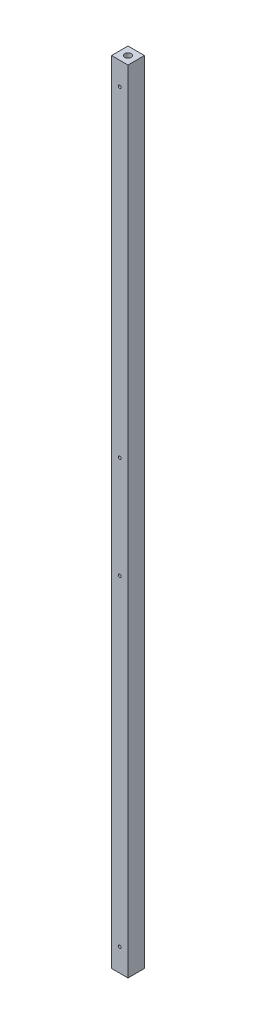
ISO-10303-21;
HEADER;
FILE_DESCRIPTION(('STEP AP214'),'2;1');
FILE_NAME('part.step','',(''),(''),'','','');
FILE_SCHEMA(('AUTOMOTIVE_DESIGN { 1 0 10303 214 1 1 1 1 }'));
ENDSEC;
DATA;
#1=APPLICATION_CONTEXT('core data for automotive mechanical design processes');
#2=APPLICATION_PROTOCOL_DEFINITION('international standard','automotive_design',2000,#1);
#3=PRODUCT_CONTEXT('',#1,'mechanical');
#4=PRODUCT('Part','Part','',(#3));
#5=PRODUCT_RELATED_PRODUCT_CATEGORY('part','',(#4));
#6=PRODUCT_DEFINITION_FORMATION('','',#4);
#7=PRODUCT_DEFINITION_CONTEXT('part definition',#1,'design');
#8=PRODUCT_DEFINITION('design','',#6,#7);
#9=PRODUCT_DEFINITION_SHAPE('','',#8);
#10=(LENGTH_UNIT() NAMED_UNIT(*) SI_UNIT(.MILLI.,.METRE.));
#11=(NAMED_UNIT(*) PLANE_ANGLE_UNIT() SI_UNIT($,.RADIAN.));
#12=(NAMED_UNIT(*) SI_UNIT($,.STERADIAN.) SOLID_ANGLE_UNIT());
#13=UNCERTAINTY_MEASURE_WITH_UNIT(LENGTH_MEASURE(1.E-05),#10,'distance_accuracy_value','');
#14=(GEOMETRIC_REPRESENTATION_CONTEXT(3) GLOBAL_UNCERTAINTY_ASSIGNED_CONTEXT((#13)) GLOBAL_UNIT_ASSIGNED_CONTEXT((#10,
#11,#12)) REPRESENTATION_CONTEXT('',''));
#15=CARTESIAN_POINT('',(0.,0.,0.));
#16=DIRECTION('',(0.,0.,1.));
#17=DIRECTION('',(1.,0.,0.));
#18=AXIS2_PLACEMENT_3D('',#15,#16,#17);
#19=CARTESIAN_POINT('',(-6.35,609.6,6.35));
#20=DIRECTION('',(0.,0.,-1.));
#21=DIRECTION('',(-1.,0.,0.));
#22=AXIS2_PLACEMENT_3D('',#19,#20,#21);
#23=PLANE('',#22);
#24=CARTESIAN_POINT('',(0.,591.847265503,6.35));
#25=DIRECTION('',(0.,0.,1.));
#26=DIRECTION('',(1.,0.,0.));
#27=AXIS2_PLACEMENT_3D('',#24,#25,#26);
#28=CIRCLE('',#27,1.13029999999999);
#29=CARTESIAN_POINT('',(1.13029999999999,591.847265503,6.35));
#30=VERTEX_POINT('',#29);
#31=EDGE_CURVE('E209',#30,#30,#28,.T.);
#32=ORIENTED_EDGE('',*,*,#31,.F.);
#33=EDGE_LOOP('',(#32));
#34=FACE_BOUND('',#33,.T.);
#35=CARTESIAN_POINT('',(0.,344.197265503,6.35));
#36=DIRECTION('',(0.,0.,1.));
#37=DIRECTION('',(1.,0.,0.));
#38=AXIS2_PLACEMENT_3D('',#35,#36,#37);
#39=CIRCLE('',#38,1.13029999999999);
#40=CARTESIAN_POINT('',(1.13029999999999,344.197265503,6.35));
#41=VERTEX_POINT('',#40);
#42=EDGE_CURVE('E204',#41,#41,#39,.T.);
#43=ORIENTED_EDGE('',*,*,#42,.F.);
#44=EDGE_LOOP('',(#43));
#45=FACE_BOUND('',#44,.T.);
#46=DIRECTION('',(1.,0.,0.));
#47=VECTOR('',#46,1.);
#48=CARTESIAN_POINT('',(-6.35,0.,6.35));
#49=LINE('',#48,#47);
#50=CARTESIAN_POINT('',(-6.35,0.,6.35));
#51=VERTEX_POINT('',#50);
#52=CARTESIAN_POINT('',(6.35,0.,6.35));
#53=VERTEX_POINT('',#52);
#54=EDGE_CURVE('E78',#51,#53,#49,.T.);
#55=ORIENTED_EDGE('',*,*,#54,.T.);
#56=DIRECTION('',(0.,-1.,0.));
#57=VECTOR('',#56,1.);
#58=CARTESIAN_POINT('',(6.35,609.6,6.35));
#59=LINE('',#58,#57);
#60=CARTESIAN_POINT('',(6.35,609.6,6.35));
#61=VERTEX_POINT('',#60);
#62=EDGE_CURVE('E134',#61,#53,#59,.T.);
#63=ORIENTED_EDGE('',*,*,#62,.F.);
#64=DIRECTION('',(1.,0.,0.));
#65=VECTOR('',#64,1.);
#66=CARTESIAN_POINT('',(-6.35,609.6,6.35));
#67=LINE('',#66,#65);
#68=CARTESIAN_POINT('',(-6.35,609.6,6.35));
#69=VERTEX_POINT('',#68);
#70=EDGE_CURVE('E54',#69,#61,#67,.T.);
#71=ORIENTED_EDGE('',*,*,#70,.F.);
#72=DIRECTION('',(0.,-1.,0.));
#73=VECTOR('',#72,1.);
#74=CARTESIAN_POINT('',(-6.35,609.6,6.35));
#75=LINE('',#74,#73);
#76=EDGE_CURVE('E142',#69,#51,#75,.T.);
#77=ORIENTED_EDGE('',*,*,#76,.T.);
#78=EDGE_LOOP('',(#55,#63,#71,#77));
#79=FACE_BOUND('',#78,.T.);
#80=CARTESIAN_POINT('',(0.,265.402734497,6.35));
#81=DIRECTION('',(0.,0.,1.));
#82=DIRECTION('',(1.,0.,0.));
#83=AXIS2_PLACEMENT_3D('',#80,#81,#82);
#84=CIRCLE('',#83,1.13029999999999);
#85=CARTESIAN_POINT('',(1.13029999999999,265.402734497,6.35));
#86=VERTEX_POINT('',#85);
#87=EDGE_CURVE('E115',#86,#86,#84,.T.);
#88=ORIENTED_EDGE('',*,*,#87,.F.);
#89=EDGE_LOOP('',(#88));
#90=FACE_BOUND('',#89,.T.);
#91=CARTESIAN_POINT('',(0.,17.752734497,6.35));
#92=DIRECTION('',(0.,0.,1.));
#93=DIRECTION('',(1.,0.,0.));
#94=AXIS2_PLACEMENT_3D('',#91,#92,#93);
#95=CIRCLE('',#94,1.13029999999999);
#96=CARTESIAN_POINT('',(1.13029999999999,17.752734497,6.35));
#97=VERTEX_POINT('',#96);
#98=EDGE_CURVE('E102',#97,#97,#95,.T.);
#99=ORIENTED_EDGE('',*,*,#98,.F.);
#100=EDGE_LOOP('',(#99));
#101=FACE_BOUND('',#100,.T.);
#102=ADVANCED_FACE('F37',(#34,#45,#79,#90,#101),#23,.F.);
#103=CARTESIAN_POINT('',(6.35,609.6,-6.35));
#104=DIRECTION('',(-1.,0.,0.));
#105=DIRECTION('',(0.,0.,1.));
#106=AXIS2_PLACEMENT_3D('',#103,#104,#105);
#107=PLANE('',#106);
#108=DIRECTION('',(0.,0.,-1.));
#109=VECTOR('',#108,1.);
#110=CARTESIAN_POINT('',(6.35,0.,-6.35));
#111=LINE('',#110,#109);
#112=CARTESIAN_POINT('',(6.35,0.,-6.35));
#113=VERTEX_POINT('',#112);
#114=EDGE_CURVE('E127',#53,#113,#111,.T.);
#115=ORIENTED_EDGE('',*,*,#114,.T.);
#116=DIRECTION('',(0.,-1.,0.));
#117=VECTOR('',#116,1.);
#118=CARTESIAN_POINT('',(6.35,609.6,-6.35));
#119=LINE('',#118,#117);
#120=CARTESIAN_POINT('',(6.35,609.6,-6.35));
#121=VERTEX_POINT('',#120);
#122=EDGE_CURVE('E11',#121,#113,#119,.T.);
#123=ORIENTED_EDGE('',*,*,#122,.F.);
#124=DIRECTION('',(0.,0.,-1.));
#125=VECTOR('',#124,1.);
#126=CARTESIAN_POINT('',(6.35,609.6,-6.35));
#127=LINE('',#126,#125);
#128=EDGE_CURVE('E128',#61,#121,#127,.T.);
#129=ORIENTED_EDGE('',*,*,#128,.F.);
#130=ORIENTED_EDGE('',*,*,#62,.T.);
#131=EDGE_LOOP('',(#115,#123,#129,#130));
#132=FACE_BOUND('',#131,.T.);
#133=ADVANCED_FACE('F39',(#132),#107,.F.);
#134=CARTESIAN_POINT('',(-6.35,609.6,-6.35));
#135=DIRECTION('',(0.,0.,1.));
#136=DIRECTION('',(1.,0.,0.));
#137=AXIS2_PLACEMENT_3D('',#134,#135,#136);
#138=PLANE('',#137);
#139=CARTESIAN_POINT('',(0.,591.847265503,-6.35));
#140=DIRECTION('',(0.,0.,1.));
#141=DIRECTION('',(1.,0.,0.));
#142=AXIS2_PLACEMENT_3D('',#139,#140,#141);
#143=CIRCLE('',#142,1.13029999999999);
#144=CARTESIAN_POINT('',(1.13029999999999,591.847265503,-6.35));
#145=VERTEX_POINT('',#144);
#146=EDGE_CURVE('E196',#145,#145,#143,.T.);
#147=ORIENTED_EDGE('',*,*,#146,.T.);
#148=EDGE_LOOP('',(#147));
#149=FACE_BOUND('',#148,.T.);
#150=CARTESIAN_POINT('',(0.,344.197265503,-6.35));
#151=DIRECTION('',(0.,0.,1.));
#152=DIRECTION('',(1.,0.,0.));
#153=AXIS2_PLACEMENT_3D('',#150,#151,#152);
#154=CIRCLE('',#153,1.13029999999999);
#155=CARTESIAN_POINT('',(1.13029999999999,344.197265503,-6.35));
#156=VERTEX_POINT('',#155);
#157=EDGE_CURVE('E109',#156,#156,#154,.T.);
#158=ORIENTED_EDGE('',*,*,#157,.T.);
#159=EDGE_LOOP('',(#158));
#160=FACE_BOUND('',#159,.T.);
#161=CARTESIAN_POINT('',(0.,17.752734497,-6.35));
#162=DIRECTION('',(0.,0.,1.));
#163=DIRECTION('',(1.,0.,0.));
#164=AXIS2_PLACEMENT_3D('',#161,#162,#163);
#165=CIRCLE('',#164,1.13029999999999);
#166=CARTESIAN_POINT('',(1.13029999999999,17.752734497,-6.35));
#167=VERTEX_POINT('',#166);
#168=EDGE_CURVE('E106',#167,#167,#165,.T.);
#169=ORIENTED_EDGE('',*,*,#168,.T.);
#170=EDGE_LOOP('',(#169));
#171=FACE_BOUND('',#170,.T.);
#172=CARTESIAN_POINT('',(0.,265.402734497,-6.35));
#173=DIRECTION('',(0.,0.,1.));
#174=DIRECTION('',(1.,0.,0.));
#175=AXIS2_PLACEMENT_3D('',#172,#173,#174);
#176=CIRCLE('',#175,1.13029999999999);
#177=CARTESIAN_POINT('',(1.13029999999999,265.402734497,-6.35));
#178=VERTEX_POINT('',#177);
#179=EDGE_CURVE('E118',#178,#178,#176,.T.);
#180=ORIENTED_EDGE('',*,*,#179,.T.);
#181=EDGE_LOOP('',(#180));
#182=FACE_BOUND('',#181,.T.);
#183=DIRECTION('',(-1.,0.,0.));
#184=VECTOR('',#183,1.);
#185=CARTESIAN_POINT('',(-6.35,0.,-6.35));
#186=LINE('',#185,#184);
#187=CARTESIAN_POINT('',(-6.35,0.,-6.35));
#188=VERTEX_POINT('',#187);
#189=EDGE_CURVE('E137',#113,#188,#186,.T.);
#190=ORIENTED_EDGE('',*,*,#189,.T.);
#191=DIRECTION('',(0.,-1.,0.));
#192=VECTOR('',#191,1.);
#193=CARTESIAN_POINT('',(-6.35,609.6,-6.35));
#194=LINE('',#193,#192);
#195=CARTESIAN_POINT('',(-6.35,609.6,-6.35));
#196=VERTEX_POINT('',#195);
#197=EDGE_CURVE('E46',#196,#188,#194,.T.);
#198=ORIENTED_EDGE('',*,*,#197,.F.);
#199=DIRECTION('',(-1.,0.,0.));
#200=VECTOR('',#199,1.);
#201=CARTESIAN_POINT('',(-6.35,609.6,-6.35));
#202=LINE('',#201,#200);
#203=EDGE_CURVE('E85',#121,#196,#202,.T.);
#204=ORIENTED_EDGE('',*,*,#203,.F.);
#205=ORIENTED_EDGE('',*,*,#122,.T.);
#206=EDGE_LOOP('',(#190,#198,#204,#205));
#207=FACE_BOUND('',#206,.T.);
#208=ADVANCED_FACE('F187',(#149,#160,#171,#182,#207),#138,.F.);
#209=CARTESIAN_POINT('',(-6.35,609.6,-6.35));
#210=DIRECTION('',(1.,0.,0.));
#211=DIRECTION('',(0.,0.,-1.));
#212=AXIS2_PLACEMENT_3D('',#209,#210,#211);
#213=PLANE('',#212);
#214=DIRECTION('',(0.,0.,1.));
#215=VECTOR('',#214,1.);
#216=CARTESIAN_POINT('',(-6.35,0.,-6.35));
#217=LINE('',#216,#215);
#218=EDGE_CURVE('E72',#188,#51,#217,.T.);
#219=ORIENTED_EDGE('',*,*,#218,.T.);
#220=ORIENTED_EDGE('',*,*,#76,.F.);
#221=DIRECTION('',(0.,0.,1.));
#222=VECTOR('',#221,1.);
#223=CARTESIAN_POINT('',(-6.35,609.6,-6.35));
#224=LINE('',#223,#222);
#225=EDGE_CURVE('E131',#196,#69,#224,.T.);
#226=ORIENTED_EDGE('',*,*,#225,.F.);
#227=ORIENTED_EDGE('',*,*,#197,.T.);
#228=EDGE_LOOP('',(#219,#220,#226,#227));
#229=FACE_BOUND('',#228,.T.);
#230=ADVANCED_FACE('F144',(#229),#213,.F.);
#231=CARTESIAN_POINT('',(0.,609.6,0.));
#232=DIRECTION('',(0.,1.,0.));
#233=DIRECTION('',(0.,0.,1.));
#234=AXIS2_PLACEMENT_3D('',#231,#232,#233);
#235=PLANE('',#234);
#236=CARTESIAN_POINT('',(0.,609.6,0.));
#237=DIRECTION('',(0.,1.,0.));
#238=DIRECTION('',(0.,0.,1.));
#239=AXIS2_PLACEMENT_3D('',#236,#237,#238);
#240=CIRCLE('',#239,2.55269999999999);
#241=CARTESIAN_POINT('',(0.,609.6,2.55269999999999));
#242=VERTEX_POINT('',#241);
#243=EDGE_CURVE('E103',#242,#242,#240,.T.);
#244=ORIENTED_EDGE('',*,*,#243,.F.);
#245=EDGE_LOOP('',(#244));
#246=FACE_BOUND('',#245,.T.);
#247=ORIENTED_EDGE('',*,*,#128,.T.);
#248=ORIENTED_EDGE('',*,*,#203,.T.);
#249=ORIENTED_EDGE('',*,*,#225,.T.);
#250=ORIENTED_EDGE('',*,*,#70,.T.);
#251=EDGE_LOOP('',(#247,#248,#249,#250));
#252=FACE_BOUND('',#251,.T.);
#253=ADVANCED_FACE('F179',(#246,#252),#235,.T.);
#254=CARTESIAN_POINT('',(0.,0.,0.));
#255=DIRECTION('',(0.,1.,0.));
#256=DIRECTION('',(0.,0.,1.));
#257=AXIS2_PLACEMENT_3D('',#254,#255,#256);
#258=PLANE('',#257);
#259=CARTESIAN_POINT('',(0.,0.,0.));
#260=DIRECTION('',(0.,-1.,0.));
#261=DIRECTION('',(0.,0.,-1.));
#262=AXIS2_PLACEMENT_3D('',#259,#260,#261);
#263=CIRCLE('',#262,2.55269999999999);
#264=CARTESIAN_POINT('',(0.,0.,-2.55269999999999));
#265=VERTEX_POINT('',#264);
#266=EDGE_CURVE('E121',#265,#265,#263,.T.);
#267=ORIENTED_EDGE('',*,*,#266,.F.);
#268=EDGE_LOOP('',(#267));
#269=FACE_BOUND('',#268,.T.);
#270=ORIENTED_EDGE('',*,*,#114,.F.);
#271=ORIENTED_EDGE('',*,*,#54,.F.);
#272=ORIENTED_EDGE('',*,*,#218,.F.);
#273=ORIENTED_EDGE('',*,*,#189,.F.);
#274=EDGE_LOOP('',(#270,#271,#272,#273));
#275=FACE_BOUND('',#274,.T.);
#276=ADVANCED_FACE('F147',(#269,#275),#258,.F.);
#277=CARTESIAN_POINT('',(0.,12.7,0.));
#278=DIRECTION('',(0.,-1.,0.));
#279=DIRECTION('',(0.,0.,-1.));
#280=AXIS2_PLACEMENT_3D('',#277,#278,#279);
#281=CONICAL_SURFACE('',#280,2.5527,1.02974425867665);
#282=CARTESIAN_POINT('',(0.,14.2338169021917,0.));
#283=VERTEX_POINT('',#282);
#284=VERTEX_LOOP('',#283);
#285=FACE_BOUND('',#284,.T.);
#286=CARTESIAN_POINT('',(0.,12.7,0.));
#287=DIRECTION('',(0.,-1.,0.));
#288=DIRECTION('',(0.,0.,-1.));
#289=AXIS2_PLACEMENT_3D('',#286,#287,#288);
#290=CIRCLE('',#289,2.5527);
#291=CARTESIAN_POINT('',(0.,12.7,-2.5527));
#292=VERTEX_POINT('',#291);
#293=EDGE_CURVE('E124',#292,#292,#290,.T.);
#294=ORIENTED_EDGE('',*,*,#293,.T.);
#295=EDGE_LOOP('',(#294));
#296=FACE_BOUND('',#295,.T.);
#297=ADVANCED_FACE('F174',(#285,#296),#281,.F.);
#298=CARTESIAN_POINT('',(0.,0.,0.));
#299=DIRECTION('',(0.,-1.,0.));
#300=DIRECTION('',(0.,0.,-1.));
#301=AXIS2_PLACEMENT_3D('',#298,#299,#300);
#302=CYLINDRICAL_SURFACE('',#301,2.55269999999999);
#303=ORIENTED_EDGE('',*,*,#293,.F.);
#304=EDGE_LOOP('',(#303));
#305=FACE_BOUND('',#304,.T.);
#306=ORIENTED_EDGE('',*,*,#266,.T.);
#307=EDGE_LOOP('',(#306));
#308=FACE_BOUND('',#307,.T.);
#309=ADVANCED_FACE('F166',(#305,#308),#302,.F.);
#310=CARTESIAN_POINT('',(0.,265.402734497,6.35));
#311=DIRECTION('',(0.,0.,1.));
#312=DIRECTION('',(1.,0.,0.));
#313=AXIS2_PLACEMENT_3D('',#310,#311,#312);
#314=CYLINDRICAL_SURFACE('',#313,1.13029999999999);
#315=ORIENTED_EDGE('',*,*,#179,.F.);
#316=EDGE_LOOP('',(#315));
#317=FACE_BOUND('',#316,.T.);
#318=ORIENTED_EDGE('',*,*,#87,.T.);
#319=EDGE_LOOP('',(#318));
#320=FACE_BOUND('',#319,.T.);
#321=ADVANCED_FACE('F160',(#317,#320),#314,.F.);
#322=CARTESIAN_POINT('',(0.,17.752734497,6.35));
#323=DIRECTION('',(0.,0.,1.));
#324=DIRECTION('',(1.,0.,0.));
#325=AXIS2_PLACEMENT_3D('',#322,#323,#324);
#326=CYLINDRICAL_SURFACE('',#325,1.13029999999999);
#327=ORIENTED_EDGE('',*,*,#168,.F.);
#328=EDGE_LOOP('',(#327));
#329=FACE_BOUND('',#328,.T.);
#330=ORIENTED_EDGE('',*,*,#98,.T.);
#331=EDGE_LOOP('',(#330));
#332=FACE_BOUND('',#331,.T.);
#333=ADVANCED_FACE('F96',(#329,#332),#326,.F.);
#334=CARTESIAN_POINT('',(0.,596.9,0.));
#335=DIRECTION('',(0.,1.,0.));
#336=DIRECTION('',(0.,0.,1.));
#337=AXIS2_PLACEMENT_3D('',#334,#335,#336);
#338=CONICAL_SURFACE('',#337,2.5527,1.02974425867668);
#339=CARTESIAN_POINT('',(0.,595.366183097808,0.));
#340=VERTEX_POINT('',#339);
#341=VERTEX_LOOP('',#340);
#342=FACE_BOUND('',#341,.T.);
#343=CARTESIAN_POINT('',(0.,596.9,0.));
#344=DIRECTION('',(0.,1.,0.));
#345=DIRECTION('',(0.,0.,1.));
#346=AXIS2_PLACEMENT_3D('',#343,#344,#345);
#347=CIRCLE('',#346,2.5527);
#348=CARTESIAN_POINT('',(0.,596.9,2.5527));
#349=VERTEX_POINT('',#348);
#350=EDGE_CURVE('E100',#349,#349,#347,.T.);
#351=ORIENTED_EDGE('',*,*,#350,.T.);
#352=EDGE_LOOP('',(#351));
#353=FACE_BOUND('',#352,.T.);
#354=ADVANCED_FACE('F92',(#342,#353),#338,.F.);
#355=CARTESIAN_POINT('',(0.,609.6,0.));
#356=DIRECTION('',(0.,1.,0.));
#357=DIRECTION('',(0.,0.,1.));
#358=AXIS2_PLACEMENT_3D('',#355,#356,#357);
#359=CYLINDRICAL_SURFACE('',#358,2.55269999999999);
#360=ORIENTED_EDGE('',*,*,#350,.F.);
#361=EDGE_LOOP('',(#360));
#362=FACE_BOUND('',#361,.T.);
#363=ORIENTED_EDGE('',*,*,#243,.T.);
#364=EDGE_LOOP('',(#363));
#365=FACE_BOUND('',#364,.T.);
#366=ADVANCED_FACE('F95',(#362,#365),#359,.F.);
#367=CARTESIAN_POINT('',(0.,344.197265503,6.35));
#368=DIRECTION('',(0.,0.,1.));
#369=DIRECTION('',(1.,0.,0.));
#370=AXIS2_PLACEMENT_3D('',#367,#368,#369);
#371=CYLINDRICAL_SURFACE('',#370,1.13029999999999);
#372=ORIENTED_EDGE('',*,*,#157,.F.);
#373=EDGE_LOOP('',(#372));
#374=FACE_BOUND('',#373,.T.);
#375=ORIENTED_EDGE('',*,*,#42,.T.);
#376=EDGE_LOOP('',(#375));
#377=FACE_BOUND('',#376,.T.);
#378=ADVANCED_FACE('F217',(#374,#377),#371,.F.);
#379=CARTESIAN_POINT('',(0.,591.847265503,6.35));
#380=DIRECTION('',(0.,0.,1.));
#381=DIRECTION('',(1.,0.,0.));
#382=AXIS2_PLACEMENT_3D('',#379,#380,#381);
#383=CYLINDRICAL_SURFACE('',#382,1.13029999999999);
#384=ORIENTED_EDGE('',*,*,#146,.F.);
#385=EDGE_LOOP('',(#384));
#386=FACE_BOUND('',#385,.T.);
#387=ORIENTED_EDGE('',*,*,#31,.T.);
#388=EDGE_LOOP('',(#387));
#389=FACE_BOUND('',#388,.T.);
#390=ADVANCED_FACE('F213',(#386,#389),#383,.F.);
#391=CLOSED_SHELL('',(#102,#133,#208,#230,#253,#276,#297,#309,#321,#333,#354,#366,#378,#390));
#392=MANIFOLD_SOLID_BREP('B2',#391);
#393=ADVANCED_BREP_SHAPE_REPRESENTATION('',(#18,#392),#14);
#394=SHAPE_DEFINITION_REPRESENTATION(#9,#393);
ENDSEC;
END-ISO-10303-21;
